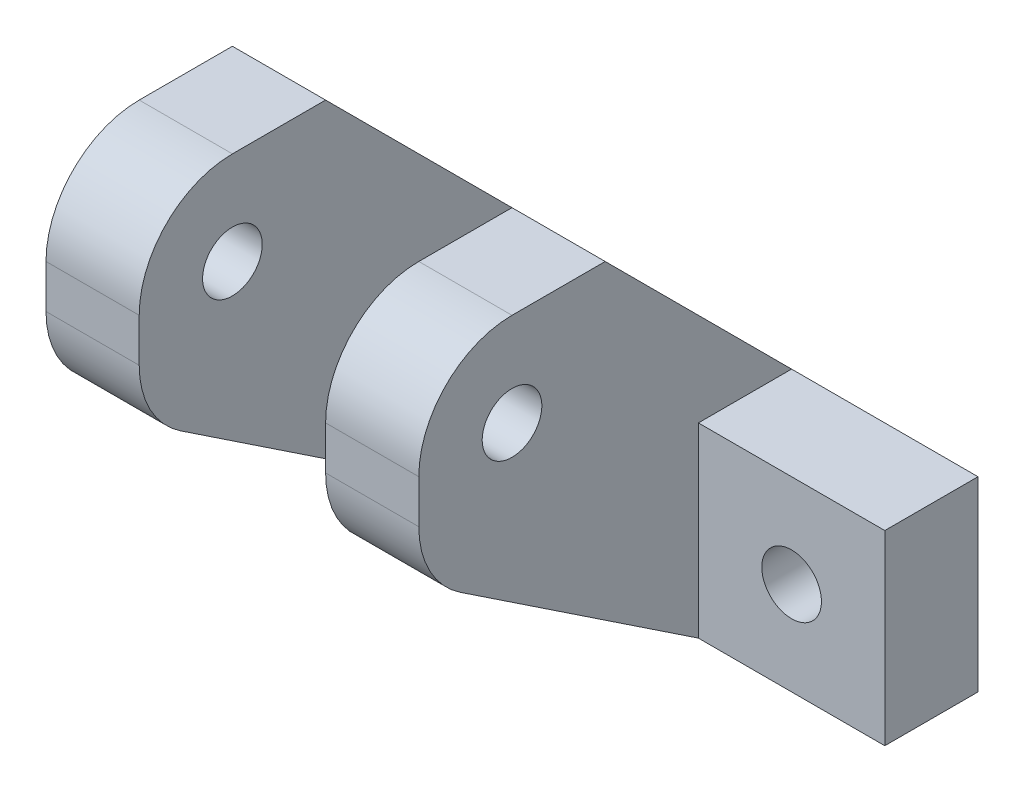
ISO-10303-21;
HEADER;
FILE_DESCRIPTION(('STEP AP214'),'2;1');
FILE_NAME('part.step','',(''),(''),'','','');
FILE_SCHEMA(('AUTOMOTIVE_DESIGN { 1 0 10303 214 1 1 1 1 }'));
ENDSEC;
DATA;
#1=APPLICATION_CONTEXT('core data for automotive mechanical design processes');
#2=APPLICATION_PROTOCOL_DEFINITION('international standard','automotive_design',2000,#1);
#3=PRODUCT_CONTEXT('',#1,'mechanical');
#4=PRODUCT('Part','Part','',(#3));
#5=PRODUCT_RELATED_PRODUCT_CATEGORY('part','',(#4));
#6=PRODUCT_DEFINITION_FORMATION('','',#4);
#7=PRODUCT_DEFINITION_CONTEXT('part definition',#1,'design');
#8=PRODUCT_DEFINITION('design','',#6,#7);
#9=PRODUCT_DEFINITION_SHAPE('','',#8);
#10=(LENGTH_UNIT() NAMED_UNIT(*) SI_UNIT(.MILLI.,.METRE.));
#11=(NAMED_UNIT(*) PLANE_ANGLE_UNIT() SI_UNIT($,.RADIAN.));
#12=(NAMED_UNIT(*) SI_UNIT($,.STERADIAN.) SOLID_ANGLE_UNIT());
#13=UNCERTAINTY_MEASURE_WITH_UNIT(LENGTH_MEASURE(1.E-05),#10,'distance_accuracy_value','');
#14=(GEOMETRIC_REPRESENTATION_CONTEXT(3) GLOBAL_UNCERTAINTY_ASSIGNED_CONTEXT((#13)) GLOBAL_UNIT_ASSIGNED_CONTEXT((#10,
#11,#12)) REPRESENTATION_CONTEXT('',''));
#15=CARTESIAN_POINT('',(0.,0.,0.));
#16=DIRECTION('',(0.,0.,1.));
#17=DIRECTION('',(1.,0.,0.));
#18=AXIS2_PLACEMENT_3D('',#15,#16,#17);
#19=CARTESIAN_POINT('',(-20.,5.,5.));
#20=DIRECTION('',(0.,-1.,0.));
#21=DIRECTION('',(1.,0.,0.));
#22=AXIS2_PLACEMENT_3D('',#19,#20,#21);
#23=PLANE('',#22);
#24=DIRECTION('',(0.,0.,1.));
#25=VECTOR('',#24,1.);
#26=CARTESIAN_POINT('',(5.,5.,20.));
#27=LINE('',#26,#25);
#28=CARTESIAN_POINT('',(5.,5.,0.));
#29=VERTEX_POINT('',#28);
#30=CARTESIAN_POINT('',(5.,5.,5.));
#31=VERTEX_POINT('',#30);
#32=EDGE_CURVE('E282',#29,#31,#27,.T.);
#33=ORIENTED_EDGE('',*,*,#32,.F.);
#34=DIRECTION('',(-1.,0.,0.));
#35=VECTOR('',#34,1.);
#36=CARTESIAN_POINT('',(-20.,5.,0.));
#37=LINE('',#36,#35);
#38=CARTESIAN_POINT('',(-5.,5.,0.));
#39=VERTEX_POINT('',#38);
#40=EDGE_CURVE('E201',#29,#39,#37,.T.);
#41=ORIENTED_EDGE('',*,*,#40,.T.);
#42=DIRECTION('',(0.,0.,-1.));
#43=VECTOR('',#42,1.);
#44=CARTESIAN_POINT('',(-5.00000000000001,5.,20.));
#45=LINE('',#44,#43);
#46=CARTESIAN_POINT('',(-5.00000000000001,5.,5.));
#47=VERTEX_POINT('',#46);
#48=EDGE_CURVE('E229',#47,#39,#45,.T.);
#49=ORIENTED_EDGE('',*,*,#48,.F.);
#50=DIRECTION('',(-1.,0.,0.));
#51=VECTOR('',#50,1.);
#52=CARTESIAN_POINT('',(-20.,5.,5.));
#53=LINE('',#52,#51);
#54=EDGE_CURVE('E331',#31,#47,#53,.T.);
#55=ORIENTED_EDGE('',*,*,#54,.F.);
#56=EDGE_LOOP('',(#33,#41,#49,#55));
#57=FACE_BOUND('',#56,.T.);
#58=ADVANCED_FACE('F33',(#57),#23,.F.);
#59=DIRECTION('',(0.,0.,-1.));
#60=VECTOR('',#59,1.);
#61=CARTESIAN_POINT('',(10.,5.,20.));
#62=LINE('',#61,#60);
#63=CARTESIAN_POINT('',(10.,5.,5.));
#64=VERTEX_POINT('',#63);
#65=CARTESIAN_POINT('',(10.,5.,0.));
#66=VERTEX_POINT('',#65);
#67=EDGE_CURVE('E278',#64,#66,#62,.T.);
#68=ORIENTED_EDGE('',*,*,#67,.F.);
#69=CARTESIAN_POINT('',(20.,5.,5.));
#70=VERTEX_POINT('',#69);
#71=EDGE_CURVE('E327',#70,#64,#53,.T.);
#72=ORIENTED_EDGE('',*,*,#71,.F.);
#73=DIRECTION('',(0.,0.,-1.));
#74=VECTOR('',#73,1.);
#75=CARTESIAN_POINT('',(20.,5.,5.));
#76=LINE('',#75,#74);
#77=CARTESIAN_POINT('',(20.,5.,0.));
#78=VERTEX_POINT('',#77);
#79=EDGE_CURVE('E227',#70,#78,#76,.T.);
#80=ORIENTED_EDGE('',*,*,#79,.T.);
#81=EDGE_CURVE('E204',#78,#66,#37,.T.);
#82=ORIENTED_EDGE('',*,*,#81,.T.);
#83=EDGE_LOOP('',(#68,#72,#80,#82));
#84=FACE_BOUND('',#83,.T.);
#85=ADVANCED_FACE('F352',(#84),#23,.F.);
#86=DIRECTION('',(0.,0.,1.));
#87=VECTOR('',#86,1.);
#88=CARTESIAN_POINT('',(-10.,5.,20.));
#89=LINE('',#88,#87);
#90=CARTESIAN_POINT('',(-10.,5.,0.));
#91=VERTEX_POINT('',#90);
#92=CARTESIAN_POINT('',(-10.,5.,5.));
#93=VERTEX_POINT('',#92);
#94=EDGE_CURVE('E184',#91,#93,#89,.T.);
#95=ORIENTED_EDGE('',*,*,#94,.F.);
#96=CARTESIAN_POINT('',(-20.,5.,0.));
#97=VERTEX_POINT('',#96);
#98=EDGE_CURVE('E192',#91,#97,#37,.T.);
#99=ORIENTED_EDGE('',*,*,#98,.T.);
#100=DIRECTION('',(0.,0.,-1.));
#101=VECTOR('',#100,1.);
#102=CARTESIAN_POINT('',(-20.,5.,5.));
#103=LINE('',#102,#101);
#104=CARTESIAN_POINT('',(-20.,5.,5.));
#105=VERTEX_POINT('',#104);
#106=EDGE_CURVE('E225',#105,#97,#103,.T.);
#107=ORIENTED_EDGE('',*,*,#106,.F.);
#108=EDGE_CURVE('E194',#93,#105,#53,.T.);
#109=ORIENTED_EDGE('',*,*,#108,.F.);
#110=EDGE_LOOP('',(#95,#99,#107,#109));
#111=FACE_BOUND('',#110,.T.);
#112=ADVANCED_FACE('F190',(#111),#23,.F.);
#113=CARTESIAN_POINT('',(0.,0.,5.));
#114=DIRECTION('',(0.,0.,1.));
#115=DIRECTION('',(1.,0.,0.));
#116=AXIS2_PLACEMENT_3D('',#113,#114,#115);
#117=PLANE('',#116);
#118=ORIENTED_EDGE('',*,*,#54,.T.);
#119=DIRECTION('',(0.,1.,0.));
#120=VECTOR('',#119,1.);
#121=CARTESIAN_POINT('',(-5.00000000000001,5.00000000000001,5.));
#122=LINE('',#121,#120);
#123=CARTESIAN_POINT('',(-5.,-5.,5.));
#124=VERTEX_POINT('',#123);
#125=EDGE_CURVE('E304',#124,#47,#122,.T.);
#126=ORIENTED_EDGE('',*,*,#125,.F.);
#127=DIRECTION('',(1.,0.,0.));
#128=VECTOR('',#127,1.);
#129=CARTESIAN_POINT('',(-20.,-5.,5.));
#130=LINE('',#129,#128);
#131=CARTESIAN_POINT('',(5.,-5.,5.));
#132=VERTEX_POINT('',#131);
#133=EDGE_CURVE('E335',#124,#132,#130,.T.);
#134=ORIENTED_EDGE('',*,*,#133,.T.);
#135=DIRECTION('',(0.,-1.,0.));
#136=VECTOR('',#135,1.);
#137=CARTESIAN_POINT('',(5.,5.00000000000001,5.));
#138=LINE('',#137,#136);
#139=EDGE_CURVE('E312',#31,#132,#138,.T.);
#140=ORIENTED_EDGE('',*,*,#139,.F.);
#141=EDGE_LOOP('',(#118,#126,#134,#140));
#142=FACE_BOUND('',#141,.T.);
#143=ADVANCED_FACE('F409',(#142),#117,.T.);
#144=CARTESIAN_POINT('',(-15.,0.,5.));
#145=DIRECTION('',(0.,0.,1.));
#146=DIRECTION('',(1.,0.,0.));
#147=AXIS2_PLACEMENT_3D('',#144,#145,#146);
#148=CIRCLE('',#147,1.6);
#149=CARTESIAN_POINT('',(-13.4,0.,5.));
#150=VERTEX_POINT('',#149);
#151=EDGE_CURVE('E296',#150,#150,#148,.T.);
#152=ORIENTED_EDGE('',*,*,#151,.F.);
#153=EDGE_LOOP('',(#152));
#154=FACE_BOUND('',#153,.T.);
#155=CARTESIAN_POINT('',(-20.,-5.,5.));
#156=VERTEX_POINT('',#155);
#157=CARTESIAN_POINT('',(-10.,-5.,5.));
#158=VERTEX_POINT('',#157);
#159=EDGE_CURVE('E223',#156,#158,#130,.T.);
#160=ORIENTED_EDGE('',*,*,#159,.T.);
#161=DIRECTION('',(0.,-1.,0.));
#162=VECTOR('',#161,1.);
#163=CARTESIAN_POINT('',(-10.,5.00000000000001,5.));
#164=LINE('',#163,#162);
#165=EDGE_CURVE('E309',#93,#158,#164,.T.);
#166=ORIENTED_EDGE('',*,*,#165,.F.);
#167=ORIENTED_EDGE('',*,*,#108,.T.);
#168=DIRECTION('',(0.,-1.,0.));
#169=VECTOR('',#168,1.);
#170=CARTESIAN_POINT('',(-20.,5.,5.));
#171=LINE('',#170,#169);
#172=EDGE_CURVE('E330',#105,#156,#171,.T.);
#173=ORIENTED_EDGE('',*,*,#172,.T.);
#174=EDGE_LOOP('',(#160,#166,#167,#173));
#175=FACE_BOUND('',#174,.T.);
#176=ADVANCED_FACE('F413',(#154,#175),#117,.T.);
#177=CARTESIAN_POINT('',(20.,5.,5.));
#178=DIRECTION('',(-1.,0.,0.));
#179=DIRECTION('',(0.,-1.,0.));
#180=AXIS2_PLACEMENT_3D('',#177,#178,#179);
#181=PLANE('',#180);
#182=DIRECTION('',(0.,1.,0.));
#183=VECTOR('',#182,1.);
#184=CARTESIAN_POINT('',(20.,5.,0.));
#185=LINE('',#184,#183);
#186=CARTESIAN_POINT('',(20.,-5.,0.));
#187=VERTEX_POINT('',#186);
#188=EDGE_CURVE('E202',#187,#78,#185,.T.);
#189=ORIENTED_EDGE('',*,*,#188,.T.);
#190=ORIENTED_EDGE('',*,*,#79,.F.);
#191=DIRECTION('',(0.,1.,0.));
#192=VECTOR('',#191,1.);
#193=CARTESIAN_POINT('',(20.,5.,5.));
#194=LINE('',#193,#192);
#195=CARTESIAN_POINT('',(20.,-5.,5.));
#196=VERTEX_POINT('',#195);
#197=EDGE_CURVE('E216',#196,#70,#194,.T.);
#198=ORIENTED_EDGE('',*,*,#197,.F.);
#199=DIRECTION('',(0.,0.,-1.));
#200=VECTOR('',#199,1.);
#201=CARTESIAN_POINT('',(20.,-5.,5.));
#202=LINE('',#201,#200);
#203=EDGE_CURVE('E219',#196,#187,#202,.T.);
#204=ORIENTED_EDGE('',*,*,#203,.T.);
#205=EDGE_LOOP('',(#189,#190,#198,#204));
#206=FACE_BOUND('',#205,.T.);
#207=ADVANCED_FACE('F351',(#206),#181,.F.);
#208=CARTESIAN_POINT('',(-20.,5.,5.));
#209=DIRECTION('',(1.,0.,0.));
#210=DIRECTION('',(0.,0.,-1.));
#211=AXIS2_PLACEMENT_3D('',#208,#209,#210);
#212=PLANE('',#211);
#213=DIRECTION('',(0.,-1.,0.));
#214=VECTOR('',#213,1.);
#215=CARTESIAN_POINT('',(-20.,5.,0.));
#216=LINE('',#215,#214);
#217=CARTESIAN_POINT('',(-20.,-5.,0.));
#218=VERTEX_POINT('',#217);
#219=EDGE_CURVE('E200',#97,#218,#216,.T.);
#220=ORIENTED_EDGE('',*,*,#219,.T.);
#221=DIRECTION('',(0.,0.,-1.));
#222=VECTOR('',#221,1.);
#223=CARTESIAN_POINT('',(-20.,-5.,5.));
#224=LINE('',#223,#222);
#225=EDGE_CURVE('E222',#156,#218,#224,.T.);
#226=ORIENTED_EDGE('',*,*,#225,.F.);
#227=ORIENTED_EDGE('',*,*,#172,.F.);
#228=ORIENTED_EDGE('',*,*,#106,.T.);
#229=EDGE_LOOP('',(#220,#226,#227,#228));
#230=FACE_BOUND('',#229,.T.);
#231=ADVANCED_FACE('F430',(#230),#212,.F.);
#232=CARTESIAN_POINT('',(-20.,-5.,5.));
#233=DIRECTION('',(0.,1.,0.));
#234=DIRECTION('',(0.,0.,1.));
#235=AXIS2_PLACEMENT_3D('',#232,#233,#234);
#236=PLANE('',#235);
#237=CARTESIAN_POINT('',(10.,-5.,5.));
#238=VERTEX_POINT('',#237);
#239=EDGE_CURVE('E333',#238,#196,#130,.T.);
#240=ORIENTED_EDGE('',*,*,#239,.F.);
#241=DIRECTION('',(-1.,0.,0.));
#242=VECTOR('',#241,1.);
#243=CARTESIAN_POINT('',(28.0277563773199,-5.,5.));
#244=LINE('',#243,#242);
#245=EDGE_CURVE('E360',#238,#132,#244,.T.);
#246=ORIENTED_EDGE('',*,*,#245,.T.);
#247=ORIENTED_EDGE('',*,*,#133,.F.);
#248=EDGE_CURVE('E364',#124,#158,#244,.T.);
#249=ORIENTED_EDGE('',*,*,#248,.T.);
#250=ORIENTED_EDGE('',*,*,#159,.F.);
#251=ORIENTED_EDGE('',*,*,#225,.T.);
#252=DIRECTION('',(1.,0.,0.));
#253=VECTOR('',#252,1.);
#254=CARTESIAN_POINT('',(-20.,-5.,0.));
#255=LINE('',#254,#253);
#256=EDGE_CURVE('E212',#218,#187,#255,.T.);
#257=ORIENTED_EDGE('',*,*,#256,.T.);
#258=ORIENTED_EDGE('',*,*,#203,.F.);
#259=EDGE_LOOP('',(#240,#246,#247,#249,#250,#251,#257,#258));
#260=FACE_BOUND('',#259,.T.);
#261=ADVANCED_FACE('F348',(#260),#236,.F.);
#262=CARTESIAN_POINT('',(15.,0.,5.));
#263=DIRECTION('',(0.,0.,1.));
#264=DIRECTION('',(1.,0.,0.));
#265=AXIS2_PLACEMENT_3D('',#262,#263,#264);
#266=CIRCLE('',#265,1.6);
#267=CARTESIAN_POINT('',(16.6,0.,5.));
#268=VERTEX_POINT('',#267);
#269=EDGE_CURVE('E301',#268,#268,#266,.T.);
#270=ORIENTED_EDGE('',*,*,#269,.F.);
#271=EDGE_LOOP('',(#270));
#272=FACE_BOUND('',#271,.T.);
#273=DIRECTION('',(0.,1.,0.));
#274=VECTOR('',#273,1.);
#275=CARTESIAN_POINT('',(10.,5.00000000000001,5.));
#276=LINE('',#275,#274);
#277=EDGE_CURVE('E319',#238,#64,#276,.T.);
#278=ORIENTED_EDGE('',*,*,#277,.F.);
#279=ORIENTED_EDGE('',*,*,#239,.T.);
#280=ORIENTED_EDGE('',*,*,#197,.T.);
#281=ORIENTED_EDGE('',*,*,#71,.T.);
#282=EDGE_LOOP('',(#278,#279,#280,#281));
#283=FACE_BOUND('',#282,.T.);
#284=ADVANCED_FACE('F343',(#272,#283),#117,.T.);
#285=CARTESIAN_POINT('',(0.,0.,0.));
#286=DIRECTION('',(0.,0.,1.));
#287=DIRECTION('',(1.,0.,0.));
#288=AXIS2_PLACEMENT_3D('',#285,#286,#287);
#289=PLANE('',#288);
#290=CARTESIAN_POINT('',(15.,0.,0.));
#291=DIRECTION('',(0.,0.,-1.));
#292=DIRECTION('',(-1.,0.,0.));
#293=AXIS2_PLACEMENT_3D('',#290,#291,#292);
#294=CIRCLE('',#293,1.6);
#295=CARTESIAN_POINT('',(13.4,0.,0.));
#296=VERTEX_POINT('',#295);
#297=EDGE_CURVE('E293',#296,#296,#294,.T.);
#298=ORIENTED_EDGE('',*,*,#297,.F.);
#299=EDGE_LOOP('',(#298));
#300=FACE_BOUND('',#299,.T.);
#301=CARTESIAN_POINT('',(-15.,0.,0.));
#302=DIRECTION('',(0.,0.,-1.));
#303=DIRECTION('',(1.,0.,0.));
#304=AXIS2_PLACEMENT_3D('',#301,#302,#303);
#305=CIRCLE('',#304,1.6);
#306=CARTESIAN_POINT('',(-13.4,0.,0.));
#307=VERTEX_POINT('',#306);
#308=EDGE_CURVE('E289',#307,#307,#305,.T.);
#309=ORIENTED_EDGE('',*,*,#308,.F.);
#310=EDGE_LOOP('',(#309));
#311=FACE_BOUND('',#310,.T.);
#312=ORIENTED_EDGE('',*,*,#98,.F.);
#313=DIRECTION('',(-1.,0.,0.));
#314=VECTOR('',#313,1.);
#315=CARTESIAN_POINT('',(24.1421356237309,5.,0.));
#316=LINE('',#315,#314);
#317=EDGE_CURVE('E168',#39,#91,#316,.T.);
#318=ORIENTED_EDGE('',*,*,#317,.F.);
#319=ORIENTED_EDGE('',*,*,#40,.F.);
#320=EDGE_CURVE('E176',#66,#29,#316,.T.);
#321=ORIENTED_EDGE('',*,*,#320,.F.);
#322=ORIENTED_EDGE('',*,*,#81,.F.);
#323=ORIENTED_EDGE('',*,*,#188,.F.);
#324=ORIENTED_EDGE('',*,*,#256,.F.);
#325=ORIENTED_EDGE('',*,*,#219,.F.);
#326=EDGE_LOOP('',(#312,#318,#319,#321,#322,#323,#324,#325));
#327=FACE_BOUND('',#326,.T.);
#328=ADVANCED_FACE('F198',(#300,#311,#327),#289,.F.);
#329=CARTESIAN_POINT('',(5.,5.00000000000001,20.));
#330=DIRECTION('',(1.,0.,0.));
#331=DIRECTION('',(0.,1.,0.));
#332=AXIS2_PLACEMENT_3D('',#329,#330,#331);
#333=PLANE('',#332);
#334=CARTESIAN_POINT('',(5.,10.,15.));
#335=DIRECTION('',(1.,0.,0.));
#336=DIRECTION('',(0.,1.,0.));
#337=AXIS2_PLACEMENT_3D('',#334,#335,#336);
#338=CIRCLE('',#337,1.6);
#339=CARTESIAN_POINT('',(5.,10.,16.6));
#340=VERTEX_POINT('',#339);
#341=EDGE_CURVE('E284',#340,#340,#338,.T.);
#342=ORIENTED_EDGE('',*,*,#341,.T.);
#343=EDGE_LOOP('',(#342));
#344=FACE_BOUND('',#343,.T.);
#345=DIRECTION('',(0.,0.,1.));
#346=VECTOR('',#345,1.);
#347=CARTESIAN_POINT('',(5.,15.,20.));
#348=LINE('',#347,#346);
#349=CARTESIAN_POINT('',(5.,15.,10.));
#350=VERTEX_POINT('',#349);
#351=CARTESIAN_POINT('',(5.,15.,15.));
#352=VERTEX_POINT('',#351);
#353=EDGE_CURVE('E267',#350,#352,#348,.T.);
#354=ORIENTED_EDGE('',*,*,#353,.F.);
#355=DIRECTION('',(0.,-0.707106781186547,-0.707106781186548));
#356=VECTOR('',#355,1.);
#357=CARTESIAN_POINT('',(5.,15.,10.));
#358=LINE('',#357,#356);
#359=EDGE_CURVE('E56',#350,#29,#358,.T.);
#360=ORIENTED_EDGE('',*,*,#359,.T.);
#361=ORIENTED_EDGE('',*,*,#32,.T.);
#362=ORIENTED_EDGE('',*,*,#139,.T.);
#363=DIRECTION('',(0.,0.554700196225229,0.832050294337844));
#364=VECTOR('',#363,1.);
#365=CARTESIAN_POINT('',(5.,5.00000000000001,20.));
#366=LINE('',#365,#364);
#367=CARTESIAN_POINT('',(5.,3.51566732075077,17.7735009811261));
#368=VERTEX_POINT('',#367);
#369=EDGE_CURVE('E362',#132,#368,#366,.T.);
#370=ORIENTED_EDGE('',*,*,#369,.T.);
#371=CARTESIAN_POINT('',(5.,7.67591879243998,15.));
#372=DIRECTION('',(1.,0.,0.));
#373=DIRECTION('',(0.,1.,0.));
#374=AXIS2_PLACEMENT_3D('',#371,#372,#373);
#375=CIRCLE('',#374,5.);
#376=CARTESIAN_POINT('',(5.,7.67591879243998,20.));
#377=VERTEX_POINT('',#376);
#378=EDGE_CURVE('E236',#368,#377,#375,.F.);
#379=ORIENTED_EDGE('',*,*,#378,.T.);
#380=DIRECTION('',(0.,-1.,0.));
#381=VECTOR('',#380,1.);
#382=CARTESIAN_POINT('',(5.,5.00000000000001,20.));
#383=LINE('',#382,#381);
#384=CARTESIAN_POINT('',(5.,10.,20.));
#385=VERTEX_POINT('',#384);
#386=EDGE_CURVE('E316',#385,#377,#383,.T.);
#387=ORIENTED_EDGE('',*,*,#386,.F.);
#388=CARTESIAN_POINT('',(5.,10.,15.));
#389=DIRECTION('',(1.,0.,0.));
#390=DIRECTION('',(0.,1.,0.));
#391=AXIS2_PLACEMENT_3D('',#388,#389,#390);
#392=CIRCLE('',#391,5.);
#393=EDGE_CURVE('E233',#385,#352,#392,.F.);
#394=ORIENTED_EDGE('',*,*,#393,.T.);
#395=EDGE_LOOP('',(#354,#360,#361,#362,#370,#379,#387,#394));
#396=FACE_BOUND('',#395,.T.);
#397=ADVANCED_FACE('F381',(#344,#396),#333,.F.);
#398=CARTESIAN_POINT('',(10.,5.00000000000001,20.));
#399=DIRECTION('',(-1.,0.,0.));
#400=DIRECTION('',(0.,0.,1.));
#401=AXIS2_PLACEMENT_3D('',#398,#399,#400);
#402=PLANE('',#401);
#403=CARTESIAN_POINT('',(10.,10.,15.));
#404=DIRECTION('',(-1.,0.,0.));
#405=DIRECTION('',(0.,0.,1.));
#406=AXIS2_PLACEMENT_3D('',#403,#404,#405);
#407=CIRCLE('',#406,1.6);
#408=CARTESIAN_POINT('',(10.,10.,16.6));
#409=VERTEX_POINT('',#408);
#410=EDGE_CURVE('E373',#409,#409,#407,.F.);
#411=ORIENTED_EDGE('',*,*,#410,.F.);
#412=EDGE_LOOP('',(#411));
#413=FACE_BOUND('',#412,.T.);
#414=ORIENTED_EDGE('',*,*,#67,.T.);
#415=DIRECTION('',(0.,-0.707106781186547,-0.707106781186548));
#416=VECTOR('',#415,1.);
#417=CARTESIAN_POINT('',(10.,5.,0.));
#418=LINE('',#417,#416);
#419=CARTESIAN_POINT('',(10.,15.,10.));
#420=VERTEX_POINT('',#419);
#421=EDGE_CURVE('E276',#420,#66,#418,.T.);
#422=ORIENTED_EDGE('',*,*,#421,.F.);
#423=DIRECTION('',(0.,0.,-1.));
#424=VECTOR('',#423,1.);
#425=CARTESIAN_POINT('',(10.,15.,20.));
#426=LINE('',#425,#424);
#427=CARTESIAN_POINT('',(10.,15.,15.));
#428=VERTEX_POINT('',#427);
#429=EDGE_CURVE('E195',#428,#420,#426,.T.);
#430=ORIENTED_EDGE('',*,*,#429,.F.);
#431=CARTESIAN_POINT('',(10.,10.,15.));
#432=DIRECTION('',(-1.,0.,0.));
#433=DIRECTION('',(0.,0.,1.));
#434=AXIS2_PLACEMENT_3D('',#431,#432,#433);
#435=CIRCLE('',#434,5.);
#436=CARTESIAN_POINT('',(10.,10.,20.));
#437=VERTEX_POINT('',#436);
#438=EDGE_CURVE('E242',#428,#437,#435,.F.);
#439=ORIENTED_EDGE('',*,*,#438,.T.);
#440=DIRECTION('',(0.,1.,0.));
#441=VECTOR('',#440,1.);
#442=CARTESIAN_POINT('',(10.,5.00000000000001,20.));
#443=LINE('',#442,#441);
#444=CARTESIAN_POINT('',(10.,7.67591879243998,20.));
#445=VERTEX_POINT('',#444);
#446=EDGE_CURVE('E206',#445,#437,#443,.T.);
#447=ORIENTED_EDGE('',*,*,#446,.F.);
#448=CARTESIAN_POINT('',(10.,7.67591879243998,15.));
#449=DIRECTION('',(-1.,0.,0.));
#450=DIRECTION('',(0.,0.,1.));
#451=AXIS2_PLACEMENT_3D('',#448,#449,#450);
#452=CIRCLE('',#451,5.);
#453=CARTESIAN_POINT('',(10.,3.51566732075077,17.7735009811261));
#454=VERTEX_POINT('',#453);
#455=EDGE_CURVE('E244',#445,#454,#452,.F.);
#456=ORIENTED_EDGE('',*,*,#455,.T.);
#457=DIRECTION('',(0.,0.554700196225229,0.832050294337844));
#458=VECTOR('',#457,1.);
#459=CARTESIAN_POINT('',(10.,5.,20.));
#460=LINE('',#459,#458);
#461=EDGE_CURVE('E355',#238,#454,#460,.T.);
#462=ORIENTED_EDGE('',*,*,#461,.F.);
#463=ORIENTED_EDGE('',*,*,#277,.T.);
#464=EDGE_LOOP('',(#414,#422,#430,#439,#447,#456,#462,#463));
#465=FACE_BOUND('',#464,.T.);
#466=ADVANCED_FACE('F273',(#413,#465),#402,.F.);
#467=CARTESIAN_POINT('',(0.,0.,20.));
#468=DIRECTION('',(0.,0.,1.));
#469=DIRECTION('',(1.,0.,0.));
#470=AXIS2_PLACEMENT_3D('',#467,#468,#469);
#471=PLANE('',#470);
#472=ORIENTED_EDGE('',*,*,#386,.T.);
#473=DIRECTION('',(-1.,0.,0.));
#474=VECTOR('',#473,1.);
#475=CARTESIAN_POINT('',(10.,7.67591879243998,20.));
#476=LINE('',#475,#474);
#477=EDGE_CURVE('E240',#377,#445,#476,.F.);
#478=ORIENTED_EDGE('',*,*,#477,.T.);
#479=ORIENTED_EDGE('',*,*,#446,.T.);
#480=DIRECTION('',(1.,0.,0.));
#481=VECTOR('',#480,1.);
#482=CARTESIAN_POINT('',(5.,10.,20.));
#483=LINE('',#482,#481);
#484=EDGE_CURVE('E238',#437,#385,#483,.F.);
#485=ORIENTED_EDGE('',*,*,#484,.T.);
#486=EDGE_LOOP('',(#472,#478,#479,#485));
#487=FACE_BOUND('',#486,.T.);
#488=ADVANCED_FACE('F461',(#487),#471,.T.);
#489=CARTESIAN_POINT('',(-5.00000000000001,5.00000000000001,20.));
#490=DIRECTION('',(-1.,0.,0.));
#491=DIRECTION('',(0.,-1.,0.));
#492=AXIS2_PLACEMENT_3D('',#489,#490,#491);
#493=PLANE('',#492);
#494=CARTESIAN_POINT('',(-5.00000000000001,10.,15.));
#495=DIRECTION('',(-1.,0.,0.));
#496=DIRECTION('',(0.,-1.,0.));
#497=AXIS2_PLACEMENT_3D('',#494,#495,#496);
#498=CIRCLE('',#497,1.6);
#499=CARTESIAN_POINT('',(-5.00000000000001,8.4,15.));
#500=VERTEX_POINT('',#499);
#501=EDGE_CURVE('E376',#500,#500,#498,.T.);
#502=ORIENTED_EDGE('',*,*,#501,.T.);
#503=EDGE_LOOP('',(#502));
#504=FACE_BOUND('',#503,.T.);
#505=ORIENTED_EDGE('',*,*,#48,.T.);
#506=DIRECTION('',(0.,0.707106781186547,0.707106781186548));
#507=VECTOR('',#506,1.);
#508=CARTESIAN_POINT('',(-5.00000000000001,15.,10.));
#509=LINE('',#508,#507);
#510=CARTESIAN_POINT('',(-5.00000000000001,15.,10.));
#511=VERTEX_POINT('',#510);
#512=EDGE_CURVE('E171',#39,#511,#509,.T.);
#513=ORIENTED_EDGE('',*,*,#512,.T.);
#514=DIRECTION('',(0.,0.,-1.));
#515=VECTOR('',#514,1.);
#516=CARTESIAN_POINT('',(-5.00000000000001,15.,20.));
#517=LINE('',#516,#515);
#518=CARTESIAN_POINT('',(-5.00000000000001,15.,15.));
#519=VERTEX_POINT('',#518);
#520=EDGE_CURVE('E287',#519,#511,#517,.T.);
#521=ORIENTED_EDGE('',*,*,#520,.F.);
#522=CARTESIAN_POINT('',(-5.00000000000001,10.,15.));
#523=DIRECTION('',(-1.,0.,0.));
#524=DIRECTION('',(0.,-1.,0.));
#525=AXIS2_PLACEMENT_3D('',#522,#523,#524);
#526=CIRCLE('',#525,5.);
#527=CARTESIAN_POINT('',(-5.00000000000001,10.,20.));
#528=VERTEX_POINT('',#527);
#529=EDGE_CURVE('E251',#519,#528,#526,.F.);
#530=ORIENTED_EDGE('',*,*,#529,.T.);
#531=DIRECTION('',(0.,1.,0.));
#532=VECTOR('',#531,1.);
#533=CARTESIAN_POINT('',(-5.00000000000001,5.00000000000001,20.));
#534=LINE('',#533,#532);
#535=CARTESIAN_POINT('',(-5.00000000000001,7.67591879243998,20.));
#536=VERTEX_POINT('',#535);
#537=EDGE_CURVE('E305',#536,#528,#534,.T.);
#538=ORIENTED_EDGE('',*,*,#537,.F.);
#539=CARTESIAN_POINT('',(-5.00000000000001,7.67591879243998,15.));
#540=DIRECTION('',(-1.,0.,0.));
#541=DIRECTION('',(0.,-1.,0.));
#542=AXIS2_PLACEMENT_3D('',#539,#540,#541);
#543=CIRCLE('',#542,5.);
#544=CARTESIAN_POINT('',(-5.00000000000001,3.51566732075077,17.7735009811261));
#545=VERTEX_POINT('',#544);
#546=EDGE_CURVE('E253',#536,#545,#543,.F.);
#547=ORIENTED_EDGE('',*,*,#546,.T.);
#548=DIRECTION('',(0.,-0.554700196225229,-0.832050294337844));
#549=VECTOR('',#548,1.);
#550=CARTESIAN_POINT('',(-5.00000000000001,5.00000000000001,20.));
#551=LINE('',#550,#549);
#552=EDGE_CURVE('E359',#545,#124,#551,.T.);
#553=ORIENTED_EDGE('',*,*,#552,.T.);
#554=ORIENTED_EDGE('',*,*,#125,.T.);
#555=EDGE_LOOP('',(#505,#513,#521,#530,#538,#547,#553,#554));
#556=FACE_BOUND('',#555,.T.);
#557=ADVANCED_FACE('F457',(#504,#556),#493,.F.);
#558=CARTESIAN_POINT('',(-10.,5.00000000000001,20.));
#559=DIRECTION('',(1.,0.,0.));
#560=DIRECTION('',(0.,0.,-1.));
#561=AXIS2_PLACEMENT_3D('',#558,#559,#560);
#562=PLANE('',#561);
#563=CARTESIAN_POINT('',(-10.,10.,15.));
#564=DIRECTION('',(-1.,0.,0.));
#565=DIRECTION('',(0.,0.,1.));
#566=AXIS2_PLACEMENT_3D('',#563,#564,#565);
#567=CIRCLE('',#566,1.6);
#568=CARTESIAN_POINT('',(-10.,10.,16.6));
#569=VERTEX_POINT('',#568);
#570=EDGE_CURVE('E370',#569,#569,#567,.T.);
#571=ORIENTED_EDGE('',*,*,#570,.F.);
#572=EDGE_LOOP('',(#571));
#573=FACE_BOUND('',#572,.T.);
#574=DIRECTION('',(0.,0.,1.));
#575=VECTOR('',#574,1.);
#576=CARTESIAN_POINT('',(-10.,15.,20.));
#577=LINE('',#576,#575);
#578=CARTESIAN_POINT('',(-10.,15.,10.));
#579=VERTEX_POINT('',#578);
#580=CARTESIAN_POINT('',(-10.,15.,15.));
#581=VERTEX_POINT('',#580);
#582=EDGE_CURVE('E186',#579,#581,#577,.T.);
#583=ORIENTED_EDGE('',*,*,#582,.F.);
#584=DIRECTION('',(0.,0.707106781186547,0.707106781186548));
#585=VECTOR('',#584,1.);
#586=CARTESIAN_POINT('',(-10.,5.,0.));
#587=LINE('',#586,#585);
#588=EDGE_CURVE('E48',#91,#579,#587,.T.);
#589=ORIENTED_EDGE('',*,*,#588,.F.);
#590=ORIENTED_EDGE('',*,*,#94,.T.);
#591=ORIENTED_EDGE('',*,*,#165,.T.);
#592=DIRECTION('',(0.,-0.554700196225229,-0.832050294337843));
#593=VECTOR('',#592,1.);
#594=CARTESIAN_POINT('',(-10.,5.,20.));
#595=LINE('',#594,#593);
#596=CARTESIAN_POINT('',(-10.,3.51566732075077,17.7735009811261));
#597=VERTEX_POINT('',#596);
#598=EDGE_CURVE('E693',#597,#158,#595,.T.);
#599=ORIENTED_EDGE('',*,*,#598,.F.);
#600=CARTESIAN_POINT('',(-10.,7.67591879243998,15.));
#601=DIRECTION('',(1.,0.,0.));
#602=DIRECTION('',(0.,0.,-1.));
#603=AXIS2_PLACEMENT_3D('',#600,#601,#602);
#604=CIRCLE('',#603,5.);
#605=CARTESIAN_POINT('',(-10.,7.67591879243998,20.));
#606=VERTEX_POINT('',#605);
#607=EDGE_CURVE('E259',#597,#606,#604,.F.);
#608=ORIENTED_EDGE('',*,*,#607,.T.);
#609=DIRECTION('',(0.,-1.,0.));
#610=VECTOR('',#609,1.);
#611=CARTESIAN_POINT('',(-10.,5.00000000000001,20.));
#612=LINE('',#611,#610);
#613=CARTESIAN_POINT('',(-10.,10.,20.));
#614=VERTEX_POINT('',#613);
#615=EDGE_CURVE('E308',#614,#606,#612,.T.);
#616=ORIENTED_EDGE('',*,*,#615,.F.);
#617=CARTESIAN_POINT('',(-10.,10.,15.));
#618=DIRECTION('',(1.,0.,0.));
#619=DIRECTION('',(0.,0.,-1.));
#620=AXIS2_PLACEMENT_3D('',#617,#618,#619);
#621=CIRCLE('',#620,5.);
#622=EDGE_CURVE('E257',#614,#581,#621,.F.);
#623=ORIENTED_EDGE('',*,*,#622,.T.);
#624=EDGE_LOOP('',(#583,#589,#590,#591,#599,#608,#616,#623));
#625=FACE_BOUND('',#624,.T.);
#626=ADVANCED_FACE('F182',(#573,#625),#562,.F.);
#627=CARTESIAN_POINT('',(0.,0.,20.));
#628=DIRECTION('',(0.,0.,-1.));
#629=DIRECTION('',(-1.,0.,0.));
#630=AXIS2_PLACEMENT_3D('',#627,#628,#629);
#631=PLANE('',#630);
#632=ORIENTED_EDGE('',*,*,#615,.T.);
#633=DIRECTION('',(1.,0.,0.));
#634=VECTOR('',#633,1.);
#635=CARTESIAN_POINT('',(0.,7.67591879243998,20.));
#636=LINE('',#635,#634);
#637=EDGE_CURVE('E248',#606,#536,#636,.T.);
#638=ORIENTED_EDGE('',*,*,#637,.T.);
#639=ORIENTED_EDGE('',*,*,#537,.T.);
#640=DIRECTION('',(1.,0.,0.));
#641=VECTOR('',#640,1.);
#642=CARTESIAN_POINT('',(0.,10.,20.));
#643=LINE('',#642,#641);
#644=EDGE_CURVE('E246',#528,#614,#643,.F.);
#645=ORIENTED_EDGE('',*,*,#644,.T.);
#646=EDGE_LOOP('',(#632,#638,#639,#645));
#647=FACE_BOUND('',#646,.T.);
#648=ADVANCED_FACE('F445',(#647),#631,.F.);
#649=CARTESIAN_POINT('',(-15.,0.,15.));
#650=DIRECTION('',(0.,0.,-1.));
#651=DIRECTION('',(-1.,0.,0.));
#652=AXIS2_PLACEMENT_3D('',#649,#650,#651);
#653=CYLINDRICAL_SURFACE('',#652,1.6);
#654=ORIENTED_EDGE('',*,*,#151,.T.);
#655=EDGE_LOOP('',(#654));
#656=FACE_BOUND('',#655,.T.);
#657=ORIENTED_EDGE('',*,*,#308,.T.);
#658=EDGE_LOOP('',(#657));
#659=FACE_BOUND('',#658,.T.);
#660=ADVANCED_FACE('F438',(#656,#659),#653,.F.);
#661=CARTESIAN_POINT('',(15.,0.,15.));
#662=DIRECTION('',(0.,0.,-1.));
#663=DIRECTION('',(-1.,0.,0.));
#664=AXIS2_PLACEMENT_3D('',#661,#662,#663);
#665=CYLINDRICAL_SURFACE('',#664,1.6);
#666=ORIENTED_EDGE('',*,*,#269,.T.);
#667=EDGE_LOOP('',(#666));
#668=FACE_BOUND('',#667,.T.);
#669=ORIENTED_EDGE('',*,*,#297,.T.);
#670=EDGE_LOOP('',(#669));
#671=FACE_BOUND('',#670,.T.);
#672=ADVANCED_FACE('F434',(#668,#671),#665,.F.);
#673=CARTESIAN_POINT('',(0.,15.,0.));
#674=DIRECTION('',(0.,-1.,0.));
#675=DIRECTION('',(0.,0.,-1.));
#676=AXIS2_PLACEMENT_3D('',#673,#674,#675);
#677=PLANE('',#676);
#678=ORIENTED_EDGE('',*,*,#520,.T.);
#679=DIRECTION('',(-1.,0.,0.));
#680=VECTOR('',#679,1.);
#681=CARTESIAN_POINT('',(24.1421356237309,15.,10.));
#682=LINE('',#681,#680);
#683=EDGE_CURVE('E688',#511,#579,#682,.T.);
#684=ORIENTED_EDGE('',*,*,#683,.T.);
#685=ORIENTED_EDGE('',*,*,#582,.T.);
#686=DIRECTION('',(1.,0.,0.));
#687=VECTOR('',#686,1.);
#688=CARTESIAN_POINT('',(0.,15.,15.));
#689=LINE('',#688,#687);
#690=EDGE_CURVE('E11',#581,#519,#689,.T.);
#691=ORIENTED_EDGE('',*,*,#690,.T.);
#692=EDGE_LOOP('',(#678,#684,#685,#691));
#693=FACE_BOUND('',#692,.T.);
#694=ADVANCED_FACE('F437',(#693),#677,.F.);
#695=CARTESIAN_POINT('',(0.,15.,0.));
#696=DIRECTION('',(0.,-1.,0.));
#697=DIRECTION('',(0.,0.,-1.));
#698=AXIS2_PLACEMENT_3D('',#695,#696,#697);
#699=PLANE('',#698);
#700=ORIENTED_EDGE('',*,*,#429,.T.);
#701=EDGE_CURVE('E695',#420,#350,#682,.T.);
#702=ORIENTED_EDGE('',*,*,#701,.T.);
#703=ORIENTED_EDGE('',*,*,#353,.T.);
#704=DIRECTION('',(1.,0.,0.));
#705=VECTOR('',#704,1.);
#706=CARTESIAN_POINT('',(10.,15.,15.));
#707=LINE('',#706,#705);
#708=EDGE_CURVE('E41',#352,#428,#707,.T.);
#709=ORIENTED_EDGE('',*,*,#708,.T.);
#710=EDGE_LOOP('',(#700,#702,#703,#709));
#711=FACE_BOUND('',#710,.T.);
#712=ADVANCED_FACE('F265',(#711),#699,.F.);
#713=CARTESIAN_POINT('',(14.5254833995939,10.,15.));
#714=DIRECTION('',(-1.,0.,0.));
#715=DIRECTION('',(0.,0.,1.));
#716=AXIS2_PLACEMENT_3D('',#713,#714,#715);
#717=CYLINDRICAL_SURFACE('',#716,1.6);
#718=ORIENTED_EDGE('',*,*,#570,.T.);
#719=EDGE_LOOP('',(#718));
#720=FACE_BOUND('',#719,.T.);
#721=ORIENTED_EDGE('',*,*,#501,.F.);
#722=EDGE_LOOP('',(#721));
#723=FACE_BOUND('',#722,.T.);
#724=ADVANCED_FACE('F387',(#720,#723),#717,.F.);
#725=CARTESIAN_POINT('',(10.,10.,16.6));
#726=CARTESIAN_POINT('',(9.94791666666667,10.,16.6));
#727=CARTESIAN_POINT('',(9.89583333333334,10.,16.6));
#728=CARTESIAN_POINT('',(9.79166666666667,10.,16.6));
#729=CARTESIAN_POINT('',(9.73958333333334,10.,16.6));
#730=CARTESIAN_POINT('',(9.63541666666667,10.,16.6));
#731=CARTESIAN_POINT('',(9.58333333333334,10.,16.6));
#732=CARTESIAN_POINT('',(9.47916666666667,10.,16.6));
#733=CARTESIAN_POINT('',(9.42708333333334,10.,16.6));
#734=CARTESIAN_POINT('',(9.32291666666667,10.,16.6));
#735=CARTESIAN_POINT('',(9.27083333333334,10.,16.6));
#736=CARTESIAN_POINT('',(9.16666666666667,10.,16.6));
#737=CARTESIAN_POINT('',(9.11458333333334,10.,16.6));
#738=CARTESIAN_POINT('',(9.01041666666667,10.,16.6));
#739=CARTESIAN_POINT('',(8.95833333333334,10.,16.6));
#740=CARTESIAN_POINT('',(8.85416666666667,10.,16.6));
#741=CARTESIAN_POINT('',(8.80208333333334,10.,16.6));
#742=CARTESIAN_POINT('',(8.69791666666667,10.,16.6));
#743=CARTESIAN_POINT('',(8.64583333333334,10.,16.6));
#744=CARTESIAN_POINT('',(8.54166666666667,10.,16.6));
#745=CARTESIAN_POINT('',(8.48958333333334,10.,16.6));
#746=CARTESIAN_POINT('',(8.38541666666667,10.,16.6));
#747=CARTESIAN_POINT('',(8.33333333333334,10.,16.6));
#748=CARTESIAN_POINT('',(8.22916666666667,10.,16.6));
#749=CARTESIAN_POINT('',(8.17708333333334,10.,16.6));
#750=CARTESIAN_POINT('',(8.07291666666667,10.,16.6));
#751=CARTESIAN_POINT('',(8.02083333333334,10.,16.6));
#752=CARTESIAN_POINT('',(7.91666666666667,10.,16.6));
#753=CARTESIAN_POINT('',(7.86458333333334,10.,16.6));
#754=CARTESIAN_POINT('',(7.76041666666667,10.,16.6));
#755=CARTESIAN_POINT('',(7.70833333333334,10.,16.6));
#756=CARTESIAN_POINT('',(7.60416666666667,10.,16.6));
#757=CARTESIAN_POINT('',(7.55208333333334,10.,16.6));
#758=CARTESIAN_POINT('',(7.44791666666667,10.,16.6));
#759=CARTESIAN_POINT('',(7.39583333333334,10.,16.6));
#760=CARTESIAN_POINT('',(7.29166666666667,10.,16.6));
#761=CARTESIAN_POINT('',(7.23958333333334,10.,16.6));
#762=CARTESIAN_POINT('',(7.13541666666667,10.,16.6));
#763=CARTESIAN_POINT('',(7.08333333333334,10.,16.6));
#764=CARTESIAN_POINT('',(6.97916666666667,10.,16.6));
#765=CARTESIAN_POINT('',(6.92708333333334,10.,16.6));
#766=CARTESIAN_POINT('',(6.82291666666667,10.,16.6));
#767=CARTESIAN_POINT('',(6.77083333333334,10.,16.6));
#768=CARTESIAN_POINT('',(6.66666666666667,10.,16.6));
#769=CARTESIAN_POINT('',(6.61458333333334,10.,16.6));
#770=CARTESIAN_POINT('',(6.51041666666667,10.,16.6));
#771=CARTESIAN_POINT('',(6.45833333333334,10.,16.6));
#772=CARTESIAN_POINT('',(6.35416666666667,10.,16.6));
#773=CARTESIAN_POINT('',(6.30208333333334,10.,16.6));
#774=CARTESIAN_POINT('',(6.19791666666667,10.,16.6));
#775=CARTESIAN_POINT('',(6.14583333333334,10.,16.6));
#776=CARTESIAN_POINT('',(6.04166666666667,10.,16.6));
#777=CARTESIAN_POINT('',(5.98958333333334,10.,16.6));
#778=CARTESIAN_POINT('',(5.88541666666667,10.,16.6));
#779=CARTESIAN_POINT('',(5.83333333333334,10.,16.6));
#780=CARTESIAN_POINT('',(5.72916666666667,10.,16.6));
#781=CARTESIAN_POINT('',(5.67708333333333,10.,16.6));
#782=CARTESIAN_POINT('',(5.57291666666667,10.,16.6));
#783=CARTESIAN_POINT('',(5.52083333333333,10.,16.6));
#784=CARTESIAN_POINT('',(5.41666666666667,10.,16.6));
#785=CARTESIAN_POINT('',(5.36458333333333,10.,16.6));
#786=CARTESIAN_POINT('',(5.26041666666667,10.,16.6));
#787=CARTESIAN_POINT('',(5.20833333333333,10.,16.6));
#788=CARTESIAN_POINT('',(5.10416666666667,10.,16.6));
#789=CARTESIAN_POINT('',(5.05208333333333,10.,16.6));
#790=CARTESIAN_POINT('',(5.,10.,16.6));
#791=B_SPLINE_CURVE_WITH_KNOTS('',3,(#725,#726,#727,#728,#729,#730,#731,#732,#733,#734,#735,
#736,#737,#738,#739,#740,#741,#742,#743,#744,#745,#746,#747,#748,#749,#750,#751,#752,#753,#754,
#755,#756,#757,#758,#759,#760,#761,#762,#763,#764,#765,#766,#767,#768,#769,#770,#771,#772,#773,
#774,#775,#776,#777,#778,#779,#780,#781,#782,#783,#784,#785,#786,#787,#788,#789,#790),
.UNSPECIFIED.,.F.,.F.,(4,2,2,2,2,2,2,2,2,2,2,2,2,2,2,2,2,2,2,2,2,2,2,2,2,2,2,2,2,2,2,2,4),(0.,
0.15625,0.3125,0.46875,0.625000000000001,0.781250000000001,0.937500000000001,1.09375,1.25,
1.40625,1.5625,1.71875,1.875,2.03125,2.1875,2.34375,2.5,2.65625,2.8125,2.96875,3.125,3.28125,
3.4375,3.59375,3.75,3.90625,4.0625,4.21875,4.375,4.53125,4.6875,4.84375,5.),.UNSPECIFIED.);
#792=EDGE_CURVE('BSEAM384',#409,#340,#791,.T.);
#793=ORIENTED_EDGE('',*,*,#410,.T.);
#794=ORIENTED_EDGE('',*,*,#341,.F.);
#795=ORIENTED_EDGE('',*,*,#792,.T.);
#796=ORIENTED_EDGE('',*,*,#792,.F.);
#797=EDGE_LOOP('',(#793,#795,#794,#796));
#798=FACE_BOUND('',#797,.T.);
#799=ADVANCED_FACE('F384',(#798),#717,.F.);
#800=CARTESIAN_POINT('',(28.0277563773199,5.,20.));
#801=DIRECTION('',(0.,0.832050294337844,-0.554700196225229));
#802=DIRECTION('',(0.,0.554700196225229,0.832050294337844));
#803=AXIS2_PLACEMENT_3D('',#800,#801,#802);
#804=PLANE('',#803);
#805=ORIENTED_EDGE('',*,*,#552,.F.);
#806=DIRECTION('',(1.,0.,0.));
#807=VECTOR('',#806,1.);
#808=CARTESIAN_POINT('',(28.0277563773199,3.51566732075077,17.7735009811261));
#809=LINE('',#808,#807);
#810=EDGE_CURVE('E255',#545,#597,#809,.F.);
#811=ORIENTED_EDGE('',*,*,#810,.T.);
#812=ORIENTED_EDGE('',*,*,#598,.T.);
#813=ORIENTED_EDGE('',*,*,#248,.F.);
#814=EDGE_LOOP('',(#805,#811,#812,#813));
#815=FACE_BOUND('',#814,.T.);
#816=ADVANCED_FACE('F386',(#815),#804,.F.);
#817=ORIENTED_EDGE('',*,*,#461,.T.);
#818=DIRECTION('',(-1.,0.,0.));
#819=VECTOR('',#818,1.);
#820=CARTESIAN_POINT('',(5.00000000000001,3.51566732075077,17.7735009811261));
#821=LINE('',#820,#819);
#822=EDGE_CURVE('E230',#454,#368,#821,.T.);
#823=ORIENTED_EDGE('',*,*,#822,.T.);
#824=ORIENTED_EDGE('',*,*,#369,.F.);
#825=ORIENTED_EDGE('',*,*,#245,.F.);
#826=EDGE_LOOP('',(#817,#823,#824,#825));
#827=FACE_BOUND('',#826,.T.);
#828=ADVANCED_FACE('F394',(#827),#804,.F.);
#829=CARTESIAN_POINT('',(28.0277563773199,7.67591879243998,15.));
#830=DIRECTION('',(1.,0.,0.));
#831=DIRECTION('',(0.,0.,-1.));
#832=AXIS2_PLACEMENT_3D('',#829,#830,#831);
#833=CYLINDRICAL_SURFACE('',#832,5.);
#834=ORIENTED_EDGE('',*,*,#455,.F.);
#835=ORIENTED_EDGE('',*,*,#477,.F.);
#836=ORIENTED_EDGE('',*,*,#378,.F.);
#837=ORIENTED_EDGE('',*,*,#822,.F.);
#838=EDGE_LOOP('',(#834,#835,#836,#837));
#839=FACE_BOUND('',#838,.T.);
#840=ADVANCED_FACE('F512',(#839),#833,.T.);
#841=CARTESIAN_POINT('',(0.,7.67591879243998,15.));
#842=DIRECTION('',(1.,0.,0.));
#843=DIRECTION('',(0.,0.,-1.));
#844=AXIS2_PLACEMENT_3D('',#841,#842,#843);
#845=CYLINDRICAL_SURFACE('',#844,5.);
#846=ORIENTED_EDGE('',*,*,#607,.F.);
#847=ORIENTED_EDGE('',*,*,#810,.F.);
#848=ORIENTED_EDGE('',*,*,#546,.F.);
#849=ORIENTED_EDGE('',*,*,#637,.F.);
#850=EDGE_LOOP('',(#846,#847,#848,#849));
#851=FACE_BOUND('',#850,.T.);
#852=ADVANCED_FACE('F520',(#851),#845,.T.);
#853=CARTESIAN_POINT('',(0.,10.,15.));
#854=DIRECTION('',(-1.,0.,0.));
#855=DIRECTION('',(0.,0.,1.));
#856=AXIS2_PLACEMENT_3D('',#853,#854,#855);
#857=CYLINDRICAL_SURFACE('',#856,5.);
#858=ORIENTED_EDGE('',*,*,#393,.F.);
#859=ORIENTED_EDGE('',*,*,#484,.F.);
#860=ORIENTED_EDGE('',*,*,#438,.F.);
#861=ORIENTED_EDGE('',*,*,#708,.F.);
#862=EDGE_LOOP('',(#858,#859,#860,#861));
#863=FACE_BOUND('',#862,.T.);
#864=ADVANCED_FACE('F530',(#863),#857,.T.);
#865=CARTESIAN_POINT('',(0.,10.,15.));
#866=DIRECTION('',(1.,0.,0.));
#867=DIRECTION('',(0.,0.,-1.));
#868=AXIS2_PLACEMENT_3D('',#865,#866,#867);
#869=CYLINDRICAL_SURFACE('',#868,5.);
#870=ORIENTED_EDGE('',*,*,#622,.F.);
#871=ORIENTED_EDGE('',*,*,#644,.F.);
#872=ORIENTED_EDGE('',*,*,#529,.F.);
#873=ORIENTED_EDGE('',*,*,#690,.F.);
#874=EDGE_LOOP('',(#870,#871,#872,#873));
#875=FACE_BOUND('',#874,.T.);
#876=ADVANCED_FACE('F35',(#875),#869,.T.);
#877=CARTESIAN_POINT('',(24.1421356237309,5.,0.));
#878=DIRECTION('',(0.,-0.707106781186548,0.707106781186547));
#879=DIRECTION('',(0.,-0.707106781186547,-0.707106781186548));
#880=AXIS2_PLACEMENT_3D('',#877,#878,#879);
#881=PLANE('',#880);
#882=ORIENTED_EDGE('',*,*,#701,.F.);
#883=ORIENTED_EDGE('',*,*,#421,.T.);
#884=ORIENTED_EDGE('',*,*,#320,.T.);
#885=ORIENTED_EDGE('',*,*,#359,.F.);
#886=EDGE_LOOP('',(#882,#883,#884,#885));
#887=FACE_BOUND('',#886,.T.);
#888=ADVANCED_FACE('F546',(#887),#881,.F.);
#889=ORIENTED_EDGE('',*,*,#317,.T.);
#890=ORIENTED_EDGE('',*,*,#588,.T.);
#891=ORIENTED_EDGE('',*,*,#683,.F.);
#892=ORIENTED_EDGE('',*,*,#512,.F.);
#893=EDGE_LOOP('',(#889,#890,#891,#892));
#894=FACE_BOUND('',#893,.T.);
#895=ADVANCED_FACE('F169',(#894),#881,.F.);
#896=CLOSED_SHELL('',(#58,#85,#112,#143,#176,#207,#231,#261,#284,#328,#397,#466,#488,#557,#626,
#648,#660,#672,#694,#712,#724,#799,#816,#828,#840,#852,#864,#876,#888,#895));
#897=MANIFOLD_SOLID_BREP('B2',#896);
#898=ADVANCED_BREP_SHAPE_REPRESENTATION('',(#18,#897),#14);
#899=SHAPE_DEFINITION_REPRESENTATION(#9,#898);
ENDSEC;
END-ISO-10303-21;
